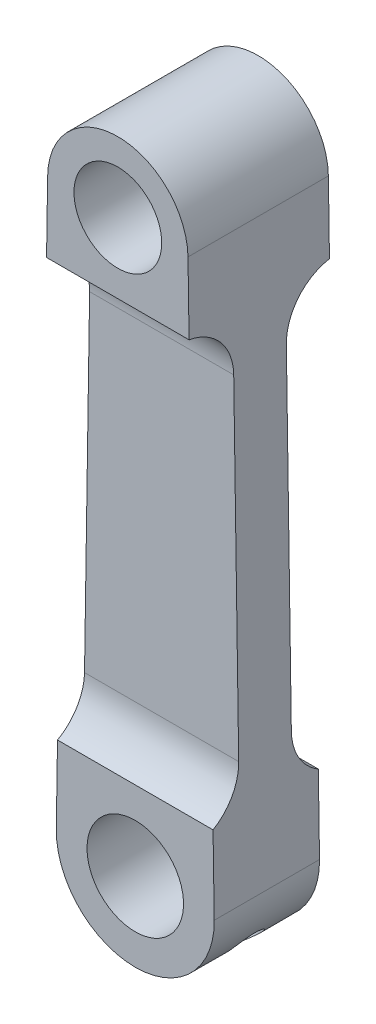
ISO-10303-21;
HEADER;
FILE_DESCRIPTION(('STEP AP214'),'2;1');
FILE_NAME('part.step','',(''),(''),'','','');
FILE_SCHEMA(('AUTOMOTIVE_DESIGN { 1 0 10303 214 1 1 1 1 }'));
ENDSEC;
DATA;
#1=APPLICATION_CONTEXT('core data for automotive mechanical design processes');
#2=APPLICATION_PROTOCOL_DEFINITION('international standard','automotive_design',2000,#1);
#3=PRODUCT_CONTEXT('',#1,'mechanical');
#4=PRODUCT('Part','Part','',(#3));
#5=PRODUCT_RELATED_PRODUCT_CATEGORY('part','',(#4));
#6=PRODUCT_DEFINITION_FORMATION('','',#4);
#7=PRODUCT_DEFINITION_CONTEXT('part definition',#1,'design');
#8=PRODUCT_DEFINITION('design','',#6,#7);
#9=PRODUCT_DEFINITION_SHAPE('','',#8);
#10=(LENGTH_UNIT() NAMED_UNIT(*) SI_UNIT(.MILLI.,.METRE.));
#11=(NAMED_UNIT(*) PLANE_ANGLE_UNIT() SI_UNIT($,.RADIAN.));
#12=(NAMED_UNIT(*) SI_UNIT($,.STERADIAN.) SOLID_ANGLE_UNIT());
#13=UNCERTAINTY_MEASURE_WITH_UNIT(LENGTH_MEASURE(1.E-05),#10,'distance_accuracy_value','');
#14=(GEOMETRIC_REPRESENTATION_CONTEXT(3) GLOBAL_UNCERTAINTY_ASSIGNED_CONTEXT((#13)) GLOBAL_UNIT_ASSIGNED_CONTEXT((#10,
#11,#12)) REPRESENTATION_CONTEXT('',''));
#15=CARTESIAN_POINT('',(0.,0.,0.));
#16=DIRECTION('',(0.,0.,1.));
#17=DIRECTION('',(1.,0.,0.));
#18=AXIS2_PLACEMENT_3D('',#15,#16,#17);
#19=CARTESIAN_POINT('',(0.,81.4999973502,26.5685520698));
#20=DIRECTION('',(0.,0.,-1.));
#21=DIRECTION('',(0.,1.,0.));
#22=AXIS2_PLACEMENT_3D('',#19,#20,#21);
#23=CYLINDRICAL_SURFACE('',#22,2.5000000038);
#24=CARTESIAN_POINT('',(0.,81.4999973502,26.5685520698));
#25=DIRECTION('',(0.,0.,-1.));
#26=DIRECTION('',(0.,1.,0.));
#27=AXIS2_PLACEMENT_3D('',#24,#25,#26);
#28=CIRCLE('',#27,2.5000000038);
#29=CARTESIAN_POINT('',(0.,83.999997354,26.5685520698));
#30=VERTEX_POINT('',#29);
#31=EDGE_CURVE('E214',#30,#30,#28,.T.);
#32=ORIENTED_EDGE('',*,*,#31,.F.);
#33=EDGE_LOOP('',(#32));
#34=FACE_BOUND('',#33,.T.);
#35=CARTESIAN_POINT('',(0.,81.4999973502,18.5685520678));
#36=DIRECTION('',(0.,0.,-1.));
#37=DIRECTION('',(0.,1.,0.));
#38=AXIS2_PLACEMENT_3D('',#35,#36,#37);
#39=CIRCLE('',#38,2.5000000038);
#40=CARTESIAN_POINT('',(0.,83.999997354,18.5685520678));
#41=VERTEX_POINT('',#40);
#42=EDGE_CURVE('E236',#41,#41,#39,.T.);
#43=ORIENTED_EDGE('',*,*,#42,.T.);
#44=EDGE_LOOP('',(#43));
#45=FACE_BOUND('',#44,.T.);
#46=ADVANCED_FACE('F16',(#34,#45),#23,.F.);
#47=CARTESIAN_POINT('',(4.493508412,48.5673633426,18.5685520678));
#48=DIRECTION('',(0.999887941750433,0.0149701016056297,0.));
#49=DIRECTION('',(-0.0149701016056297,0.999887941750433,0.));
#50=AXIS2_PLACEMENT_3D('',#47,#48,#49);
#51=PLANE('',#50);
#52=DIRECTION('',(-0.0149701016056297,0.999887941750433,0.));
#53=VECTOR('',#52,1.);
#54=CARTESIAN_POINT('',(4.493508412,48.5673633426,18.5685520678));
#55=LINE('',#54,#53);
#56=CARTESIAN_POINT('',(4.06034643128432,77.4992605836624,18.5685520701346));
#57=VERTEX_POINT('',#56);
#58=CARTESIAN_POINT('',(3.99955176753491,81.5598777570202,18.5685520678));
#59=VERTEX_POINT('',#58);
#60=EDGE_CURVE('E257',#57,#59,#55,.T.);
#61=ORIENTED_EDGE('',*,*,#60,.T.);
#62=DIRECTION('',(0.,0.,-1.));
#63=VECTOR('',#62,1.);
#64=CARTESIAN_POINT('',(3.99955176798995,81.5598777574168,22.5685520688));
#65=LINE('',#64,#63);
#66=CARTESIAN_POINT('',(3.99955177192008,81.5598777582927,26.5685520698));
#67=VERTEX_POINT('',#66);
#68=EDGE_CURVE('E212',#59,#67,#65,.F.);
#69=ORIENTED_EDGE('',*,*,#68,.T.);
#70=DIRECTION('',(-0.0149701022089109,0.999887941741401,0.));
#71=VECTOR('',#70,1.);
#72=CARTESIAN_POINT('',(4.06034644230824,77.4992605993605,26.5685520698));
#73=LINE('',#72,#71);
#74=CARTESIAN_POINT('',(4.06034643664644,77.4992606015195,26.5685520682785));
#75=VERTEX_POINT('',#74);
#76=EDGE_CURVE('E243',#75,#67,#73,.T.);
#77=ORIENTED_EDGE('',*,*,#76,.F.);
#78=CARTESIAN_POINT('',(4.10463367244879,74.5412126304615,27.0685520604));
#79=DIRECTION('',(0.999887941750433,0.0149701016056297,0.));
#80=DIRECTION('',(0.0149701016056297,-0.999887941750433,0.));
#81=AXIS2_PLACEMENT_3D('',#78,#79,#80);
#82=ELLIPSE('',#81,3.00034440865254,2.99999999674174);
#83=CARTESIAN_POINT('',(4.10463368120887,74.5412126267578,24.0685520633135));
#84=VERTEX_POINT('',#83);
#85=EDGE_CURVE('E244',#84,#75,#82,.T.);
#86=ORIENTED_EDGE('',*,*,#85,.F.);
#87=DIRECTION('',(-0.0149701007964448,0.999887941762548,0.));
#88=VECTOR('',#87,1.);
#89=CARTESIAN_POINT('',(4.38825809881793,55.5972769573051,24.068552066));
#90=LINE('',#89,#88);
#91=CARTESIAN_POINT('',(4.38825809785737,55.5972769521677,24.0685520686545));
#92=VERTEX_POINT('',#91);
#93=EDGE_CURVE('E89',#92,#84,#90,.T.);
#94=ORIENTED_EDGE('',*,*,#93,.F.);
#95=CARTESIAN_POINT('',(4.38825809689681,55.5972769470302,27.0685520604));
#96=DIRECTION('',(0.999887941750433,0.0149701016056297,0.));
#97=DIRECTION('',(-0.0149701016056297,0.999887941750433,0.));
#98=AXIS2_PLACEMENT_3D('',#95,#96,#97);
#99=ELLIPSE('',#98,3.00034440100083,2.99999998909091);
#100=CARTESIAN_POINT('',(4.42715602844908,52.9991936466253,25.5685520649593));
#101=VERTEX_POINT('',#100);
#102=EDGE_CURVE('E20',#101,#92,#99,.T.);
#103=ORIENTED_EDGE('',*,*,#102,.F.);
#104=DIRECTION('',(-0.0149701012397635,0.99988794175591,0.));
#105=VECTOR('',#104,1.);
#106=CARTESIAN_POINT('',(4.49350841370545,48.5673633516394,25.5685520632));
#107=LINE('',#106,#105);
#108=CARTESIAN_POINT('',(4.49350841489874,48.567363351097,25.5685520632));
#109=VERTEX_POINT('',#108);
#110=EDGE_CURVE('E87',#109,#101,#107,.T.);
#111=ORIENTED_EDGE('',*,*,#110,.F.);
#112=DIRECTION('',(0.,0.,1.));
#113=VECTOR('',#112,1.);
#114=CARTESIAN_POINT('',(4.49350841606476,48.5673633523763,22.5685520688));
#115=LINE('',#114,#113);
#116=CARTESIAN_POINT('',(4.49350841396623,48.5673633519064,19.5685520744));
#117=VERTEX_POINT('',#116);
#118=EDGE_CURVE('E203',#109,#117,#115,.F.);
#119=ORIENTED_EDGE('',*,*,#118,.T.);
#120=DIRECTION('',(-0.0149701016056297,0.999887941750433,0.));
#121=VECTOR('',#120,1.);
#122=CARTESIAN_POINT('',(4.493508412,48.5673633426,19.5685520744));
#123=LINE('',#122,#121);
#124=CARTESIAN_POINT('',(4.42715602675402,52.9991936441981,19.5685520744));
#125=VERTEX_POINT('',#124);
#126=EDGE_CURVE('E202',#117,#125,#123,.T.);
#127=ORIENTED_EDGE('',*,*,#126,.T.);
#128=CARTESIAN_POINT('',(4.38825809678039,55.5972769548059,18.0685520772));
#129=DIRECTION('',(0.999887941750433,0.0149701016056297,0.));
#130=DIRECTION('',(0.0149701016056297,-0.999887941750433,0.));
#131=AXIS2_PLACEMENT_3D('',#128,#129,#130);
#132=ELLIPSE('',#131,3.0003444137,3.00000000178862);
#133=CARTESIAN_POINT('',(4.38825809681372,55.5972769525799,21.0685520789886));
#134=VERTEX_POINT('',#133);
#135=EDGE_CURVE('E109',#134,#125,#132,.T.);
#136=ORIENTED_EDGE('',*,*,#135,.F.);
#137=DIRECTION('',(-0.0149701016056297,0.999887941750433,0.));
#138=VECTOR('',#137,1.);
#139=CARTESIAN_POINT('',(4.493508412,48.5673633426,21.0685520716));
#140=LINE('',#139,#138);
#141=CARTESIAN_POINT('',(4.10463367269257,74.5412126141785,21.0685520727697));
#142=VERTEX_POINT('',#141);
#143=EDGE_CURVE('E231',#134,#142,#140,.T.);
#144=ORIENTED_EDGE('',*,*,#143,.T.);
#145=CARTESIAN_POINT('',(4.10463367271639,74.5412126125874,18.0685520772));
#146=DIRECTION('',(0.999887941750433,0.0149701016056297,0.));
#147=DIRECTION('',(-0.0149701016056297,0.999887941750433,0.));
#148=AXIS2_PLACEMENT_3D('',#145,#146,#147);
#149=ELLIPSE('',#148,3.00034440865026,2.99999999673946);
#150=EDGE_CURVE('E235',#57,#142,#149,.T.);
#151=ORIENTED_EDGE('',*,*,#150,.F.);
#152=EDGE_LOOP('',(#61,#69,#77,#86,#94,#103,#111,#119,#127,#136,#144,#151));
#153=FACE_BOUND('',#152,.T.);
#154=ADVANCED_FACE('F84',(#153),#51,.T.);
#155=CARTESIAN_POINT('',(-0.00598731340000001,48.4999978944,25.5685520632));
#156=DIRECTION('',(0.,0.,-1.));
#157=DIRECTION('',(-1.,0.,0.));
#158=AXIS2_PLACEMENT_3D('',#155,#156,#157);
#159=CYLINDRICAL_SURFACE('',#158,2.7500000118);
#160=CARTESIAN_POINT('',(-0.00598731340000001,48.4999978944,25.5685520632));
#161=DIRECTION('',(0.,0.,-1.));
#162=DIRECTION('',(-1.,0.,0.));
#163=AXIS2_PLACEMENT_3D('',#160,#161,#162);
#164=CIRCLE('',#163,2.7500000118);
#165=CARTESIAN_POINT('',(-2.7559873252,48.4999978944,25.5685520632));
#166=VERTEX_POINT('',#165);
#167=EDGE_CURVE('E103',#166,#166,#164,.T.);
#168=ORIENTED_EDGE('',*,*,#167,.F.);
#169=EDGE_LOOP('',(#168));
#170=FACE_BOUND('',#169,.T.);
#171=CARTESIAN_POINT('',(-0.00598731340000001,48.4999978944,19.5685520744));
#172=DIRECTION('',(0.,0.,-1.));
#173=DIRECTION('',(-1.,0.,0.));
#174=AXIS2_PLACEMENT_3D('',#171,#172,#173);
#175=CIRCLE('',#174,2.7500000118);
#176=CARTESIAN_POINT('',(-2.7559873252,48.4999978944,19.5685520744));
#177=VERTEX_POINT('',#176);
#178=EDGE_CURVE('E198',#177,#177,#175,.T.);
#179=ORIENTED_EDGE('',*,*,#178,.T.);
#180=EDGE_LOOP('',(#179));
#181=FACE_BOUND('',#180,.T.);
#182=CARTESIAN_POINT('',(2.51234114031025,47.395225598184,22.5685520683898));
#183=CARTESIAN_POINT('',(2.51234096619776,47.3952211985976,22.514494560565));
#184=CARTESIAN_POINT('',(2.510450991853,47.3908855763633,22.4603841918302));
#185=CARTESIAN_POINT('',(2.50285492022981,47.3738125252695,22.3537315913413));
#186=CARTESIAN_POINT('',(2.49714264181015,47.361061488095,22.3011920437987));
#187=CARTESIAN_POINT('',(2.48182965598258,47.3279931344561,22.199332972728));
#188=CARTESIAN_POINT('',(2.4722402904659,47.3076979013512,22.1500045400487));
#189=CARTESIAN_POINT('',(2.44903662345772,47.2606257268212,22.0555919818943));
#190=CARTESIAN_POINT('',(2.43542243684333,47.2338489703969,22.0105077353293));
#191=CARTESIAN_POINT('',(2.40333199922162,47.1737676763861,21.9237323257375));
#192=CARTESIAN_POINT('',(2.38467344928783,47.1402337846818,21.8822672936029));
#193=CARTESIAN_POINT('',(2.34263627089483,47.0688510171367,21.8059553745119));
#194=CARTESIAN_POINT('',(2.31925649903329,47.0310010969932,21.7711100947258));
#195=CARTESIAN_POINT('',(2.26691075360155,46.9511985588941,21.7079615509369));
#196=CARTESIAN_POINT('',(2.2377911780357,46.9091539148221,21.679900713297));
#197=CARTESIAN_POINT('',(2.17469204272838,46.8237065815634,21.6327347395387));
#198=CARTESIAN_POINT('',(2.14071407453093,46.7803043407306,21.6136266793436));
#199=CARTESIAN_POINT('',(2.0699735402066,46.6956129635321,21.5856919015266));
#200=CARTESIAN_POINT('',(2.03338112504607,46.654309856029,21.576477547251));
#201=CARTESIAN_POINT('',(1.95720353933929,46.5734824146185,21.5673524049975));
#202=CARTESIAN_POINT('',(1.91761928908483,46.5339575396443,21.5674387676538));
#203=CARTESIAN_POINT('',(1.83860131895394,46.4597043609429,21.5766811079299));
#204=CARTESIAN_POINT('',(1.79924642152885,46.4248384061898,21.5854145680766));
#205=CARTESIAN_POINT('',(1.7202096446299,46.3586425277945,21.6109959360563));
#206=CARTESIAN_POINT('',(1.6805277413476,46.3273128641051,21.6278444399474));
#207=CARTESIAN_POINT('',(1.60158786384854,46.2682567014926,21.6693881242126));
#208=CARTESIAN_POINT('',(1.5623439901196,46.2405879141512,21.6941917059703));
#209=CARTESIAN_POINT('',(1.4861957703355,46.1895881903245,21.7508464629601));
#210=CARTESIAN_POINT('',(1.449292048903,46.1662584088016,21.7826995097011));
#211=CARTESIAN_POINT('',(1.37717685451721,46.1227667978942,21.854606762493));
#212=CARTESIAN_POINT('',(1.34217115125981,46.1028508370614,21.8950165422776));
#213=CARTESIAN_POINT('',(1.27766433510844,46.0676961430175,21.9818629296322));
#214=CARTESIAN_POINT('',(1.24816616441278,46.0524599069912,22.0283027361934));
#215=CARTESIAN_POINT('',(1.1955930910079,46.0262177837185,22.127094820053));
#216=CARTESIAN_POINT('',(1.1726618772368,46.0153047769641,22.1795485845037));
#217=CARTESIAN_POINT('',(1.13547161949544,45.9979988694358,22.2880787337553));
#218=CARTESIAN_POINT('',(1.12119405585221,45.9915963110494,22.3441470962036));
#219=CARTESIAN_POINT('',(1.10712747855165,45.9853415494268,22.4287268308869));
#220=CARTESIAN_POINT('',(1.10366368246204,45.9838140430455,22.4565519360204));
#221=CARTESIAN_POINT('',(1.09903431999063,45.9817775693018,22.5124306329612));
#222=CARTESIAN_POINT('',(1.09786875826505,45.9812686040031,22.5404842252312));
#223=CARTESIAN_POINT('',(1.09787544133482,45.9812688612635,22.6226095757722));
#224=CARTESIAN_POINT('',(1.10221175059898,45.9831572703819,22.6767199441095));
#225=CARTESIAN_POINT('',(1.11928755809903,45.990747151945,22.7833725443552));
#226=CARTESIAN_POINT('',(1.13204066693938,45.9964548005979,22.8359120920426));
#227=CARTESIAN_POINT('',(1.16511457499445,46.0117557837621,22.9377711631413));
#228=CARTESIAN_POINT('',(1.18541328670774,46.0213377843751,22.9870995957146));
#229=CARTESIAN_POINT('',(1.23249387835758,46.0445243683765,23.0815121534752));
#230=CARTESIAN_POINT('',(1.25927557322367,46.0581288369375,23.1265963997708));
#231=CARTESIAN_POINT('',(1.31936850814086,46.0901974694866,23.2133718090702));
#232=CARTESIAN_POINT('',(1.35290916847,46.108843849184,23.2548368411625));
#233=CARTESIAN_POINT('',(1.42430718586535,46.1508551208964,23.3311487603255));
#234=CARTESIAN_POINT('',(1.46216558765836,46.1742211559449,23.3659940402116));
#235=CARTESIAN_POINT('',(1.54198711615095,46.2265379387081,23.4291425844375));
#236=CARTESIAN_POINT('',(1.58404232471681,46.25564225504,23.4572034223744));
#237=CARTESIAN_POINT('',(1.66951255048077,46.3187103787603,23.5043693966838));
#238=CARTESIAN_POINT('',(1.71292711874652,46.3526725947636,23.5234774571401));
#239=CARTESIAN_POINT('',(1.7976441615131,46.4233823914277,23.5514122354536));
#240=CARTESIAN_POINT('',(1.83896054540377,46.4599598160671,23.5606265899529));
#241=CARTESIAN_POINT('',(1.91981562573732,46.5361080660838,23.5697517325572));
#242=CARTESIAN_POINT('',(1.95935486291266,46.5756779709734,23.569665370027));
#243=CARTESIAN_POINT('',(2.03363671149544,46.6546689908288,23.5604230298887));
#244=CARTESIAN_POINT('',(2.0685169453304,46.6940112333881,23.5516895697995));
#245=CARTESIAN_POINT('',(2.1347415007758,46.77302398372,23.526108201869));
#246=CARTESIAN_POINT('',(2.16608556244105,46.8126945153955,23.5092596979673));
#247=CARTESIAN_POINT('',(2.22517036723468,46.8916129570307,23.467716013709));
#248=CARTESIAN_POINT('',(2.25285339368822,46.9308467874507,23.4429124320057));
#249=CARTESIAN_POINT('',(2.30388074702044,47.0069764948561,23.3862576751533));
#250=CARTESIAN_POINT('',(2.32722391871494,47.0438717476405,23.3544046285029));
#251=CARTESIAN_POINT('',(2.37074169604298,47.1159711543143,23.2824973760378));
#252=CARTESIAN_POINT('',(2.39067035848792,47.1509696277564,23.2420875965131));
#253=CARTESIAN_POINT('',(2.42584845854555,47.2154636820639,23.1552412096333));
#254=CARTESIAN_POINT('',(2.44109539789332,47.2449563216227,23.1088014032709));
#255=CARTESIAN_POINT('',(2.46735659757443,47.2975198685225,23.0100093196964));
#256=CARTESIAN_POINT('',(2.47827792527046,47.3204471206176,22.9575555553155));
#257=CARTESIAN_POINT('',(2.49559732675055,47.3576310956096,22.8490254064476));
#258=CARTESIAN_POINT('',(2.50200506488944,47.3719063347123,22.7929570443298));
#259=CARTESIAN_POINT('',(2.50826493269155,47.3859706419075,22.7083773094388));
#260=CARTESIAN_POINT('',(2.50979369714299,47.3894338837929,22.6805522037219));
#261=CARTESIAN_POINT('',(2.51183184718833,47.3940625064439,22.6246735053916));
#262=CARTESIAN_POINT('',(2.51234123071328,47.3952278825458,22.5966199123146));
#263=CARTESIAN_POINT('',(2.51234114031025,47.395225598184,22.5685520683898));
#264=B_SPLINE_CURVE_WITH_KNOTS('',3,(#182,#183,#184,#185,#186,#187,#188,#189,#190,#191,#192,
#193,#194,#195,#196,#197,#198,#199,#200,#201,#202,#203,#204,#205,#206,#207,#208,#209,#210,#211,
#212,#213,#214,#215,#216,#217,#218,#219,#220,#221,#222,#223,#224,#225,#226,#227,#228,#229,#230,
#231,#232,#233,#234,#235,#236,#237,#238,#239,#240,#241,#242,#243,#244,#245,#246,#247,#248,#249,
#250,#251,#252,#253,#254,#255,#256,#257,#258,#259,#260,#261,#262,#263),.UNSPECIFIED.,.T.,.F.,(4,
2,2,2,2,2,2,2,2,2,2,2,2,2,2,2,2,2,2,2,2,2,2,2,2,2,2,2,2,2,2,2,2,2,2,2,2,2,2,2,4),(0.,
0.162062858142711,0.324388427499844,0.4862425321847,0.648092017649166,0.816831109690325,
0.985611116681562,1.15974200512968,1.33381598077638,1.500788418408,1.66770970254039,
1.82685823102374,1.98601845091202,2.14744686690715,2.30891819082416,2.47930022439786,
2.64977301954262,2.82373191406314,2.99731719246503,3.08146361096277,3.16561019994133,
3.32767305739332,3.48999862703251,3.65185273144392,3.8137022159325,3.98244130763824,
4.1512213146589,4.32535220405047,4.49942618050444,4.66639861915663,4.83331990432889,
4.99246843305231,5.15162865322387,5.31305706872001,5.47452839196484,5.64491042428042,
5.81538321862294,5.98934211292271,6.16292739033139,6.24707381067454,6.33122040180292),.UNSPECIFIED.);
#265=CARTESIAN_POINT('',(2.51234114031025,47.395225598184,22.5685520683898));
#266=VERTEX_POINT('',#265);
#267=EDGE_CURVE('E106',#266,#266,#264,.T.);
#268=ORIENTED_EDGE('',*,*,#267,.F.);
#269=EDGE_LOOP('',(#268));
#270=FACE_BOUND('',#269,.T.);
#271=ADVANCED_FACE('F124',(#170,#181,#270),#159,.F.);
#272=CARTESIAN_POINT('',(4.48081532613272,55.5972601540036,27.0685520604));
#273=DIRECTION('',(-0.999999983540856,0.000181433977996246,0.));
#274=DIRECTION('',(-0.000181433977996246,-0.999999983540856,0.));
#275=AXIS2_PLACEMENT_3D('',#272,#273,#274);
#276=CYLINDRICAL_SURFACE('',#275,2.99999998909091);
#277=DIRECTION('',(0.99999998354112,-0.000181432523983697,0.));
#278=VECTOR('',#277,1.);
#279=CARTESIAN_POINT('',(-0.0046994825999994,55.5980739827,24.068552066));
#280=LINE('',#279,#278);
#281=CARTESIAN_POINT('',(-4.39765708304414,55.5988710093481,24.0685520686545));
#282=VERTEX_POINT('',#281);
#283=EDGE_CURVE('E93',#282,#92,#280,.T.);
#284=ORIENTED_EDGE('',*,*,#283,.F.);
#285=CARTESIAN_POINT('',(-4.39765708302498,55.5988710105979,27.0685520604));
#286=DIRECTION('',(-0.999882443743837,0.0153329283847569,0.));
#287=DIRECTION('',(-0.0153329283847569,-0.999882443743837,0.));
#288=AXIS2_PLACEMENT_3D('',#285,#286,#287);
#289=ELLIPSE('',#288,3.00034440102252,2.99999998909091);
#290=CARTESIAN_POINT('',(-4.43749777271393,53.0008019942295,25.568552066375));
#291=VERTEX_POINT('',#290);
#292=EDGE_CURVE('E100',#291,#282,#289,.F.);
#293=ORIENTED_EDGE('',*,*,#292,.F.);
#294=DIRECTION('',(-0.999999983540897,0.000181433750679129,0.));
#295=VECTOR('',#294,1.);
#296=CARTESIAN_POINT('',(-0.0051708685000003,52.9999978225,25.5685520632));
#297=LINE('',#296,#295);
#298=EDGE_CURVE('E96',#101,#291,#297,.T.);
#299=ORIENTED_EDGE('',*,*,#298,.F.);
#300=ORIENTED_EDGE('',*,*,#102,.T.);
#301=EDGE_LOOP('',(#284,#293,#299,#300));
#302=FACE_BOUND('',#301,.T.);
#303=ADVANCED_FACE('F97',(#302),#276,.F.);
#304=CARTESIAN_POINT('',(-4.4469355054,74.542764173,24.068552066));
#305=DIRECTION('',(0.,0.,1.));
#306=DIRECTION('',(-0.000181433322537988,-0.999999983540975,0.));
#307=AXIS2_PLACEMENT_3D('',#304,#305,#306);
#308=PLANE('',#307);
#309=DIRECTION('',(-0.999999983540856,0.000181433978000328,9.06166437992229E-10));
#310=VECTOR('',#309,1.);
#311=CARTESIAN_POINT('',(-0.00126242343362034,74.5419575783816,24.0685520636583));
#312=LINE('',#311,#310);
#313=CARTESIAN_POINT('',(-4.10715852111188,74.5427025280332,24.0685520659676));
#314=VERTEX_POINT('',#313);
#315=EDGE_CURVE('E245',#314,#84,#312,.F.);
#316=ORIENTED_EDGE('',*,*,#315,.F.);
#317=DIRECTION('',(0.0153329283847569,0.999882443743837,0.));
#318=VECTOR('',#317,1.);
#319=CARTESIAN_POINT('',(-4.2524940477,65.0651625669,24.068552069175));
#320=LINE('',#319,#318);
#321=EDGE_CURVE('E195',#282,#314,#320,.T.);
#322=ORIENTED_EDGE('',*,*,#321,.F.);
#323=ORIENTED_EDGE('',*,*,#283,.T.);
#324=ORIENTED_EDGE('',*,*,#93,.T.);
#325=EDGE_LOOP('',(#316,#322,#323,#324));
#326=FACE_BOUND('',#325,.T.);
#327=ADVANCED_FACE('F136',(#326),#308,.T.);
#328=CARTESIAN_POINT('',(-4.15642928453273,74.542711468001,27.0685520604));
#329=DIRECTION('',(0.999999983540856,-0.000181433978000861,0.));
#330=DIRECTION('',(0.000181433978000861,0.999999983540856,0.));
#331=AXIS2_PLACEMENT_3D('',#328,#329,#330);
#332=CYLINDRICAL_SURFACE('',#331,2.99999999674174);
#333=ORIENTED_EDGE('',*,*,#315,.T.);
#334=ORIENTED_EDGE('',*,*,#85,.T.);
#335=DIRECTION('',(0.999999983540997,-0.000181433201969554,0.));
#336=VECTOR('',#335,1.);
#337=CARTESIAN_POINT('',(-0.000725728799999981,77.4999974127,26.5685520698));
#338=LINE('',#337,#336);
#339=CARTESIAN_POINT('',(-4.0617979004164,77.5007342316064,26.5685520698));
#340=VERTEX_POINT('',#339);
#341=EDGE_CURVE('E240',#340,#75,#338,.T.);
#342=ORIENTED_EDGE('',*,*,#341,.F.);
#343=CARTESIAN_POINT('',(-4.10715852110303,74.5427025286102,27.0685520604));
#344=DIRECTION('',(-0.999882443743837,0.0153329283847569,0.));
#345=DIRECTION('',(0.0153329283847569,0.999882443743837,0.));
#346=AXIS2_PLACEMENT_3D('',#343,#344,#345);
#347=ELLIPSE('',#346,3.00034440867423,2.99999999674174);
#348=EDGE_CURVE('E191',#314,#340,#347,.F.);
#349=ORIENTED_EDGE('',*,*,#348,.F.);
#350=EDGE_LOOP('',(#333,#334,#342,#349));
#351=FACE_BOUND('',#350,.T.);
#352=ADVANCED_FACE('F139',(#351),#332,.F.);
#353=CARTESIAN_POINT('',(-4.1090705982,85.5487429484,26.5685520698));
#354=DIRECTION('',(0.,0.,1.));
#355=DIRECTION('',(-0.000181432628930043,-0.9999999835411,0.));
#356=AXIS2_PLACEMENT_3D('',#353,#354,#355);
#357=PLANE('',#356);
#358=ORIENTED_EDGE('',*,*,#31,.T.);
#359=EDGE_LOOP('',(#358));
#360=FACE_BOUND('',#359,.T.);
#361=ORIENTED_EDGE('',*,*,#341,.T.);
#362=ORIENTED_EDGE('',*,*,#76,.T.);
#363=CARTESIAN_POINT('',(0.,81.4999973502,26.5685520698));
#364=DIRECTION('',(0.,0.,1.));
#365=DIRECTION('',(0.,-1.,0.));
#366=AXIS2_PLACEMENT_3D('',#363,#364,#365);
#367=CIRCLE('',#366,4.000000001);
#368=CARTESIAN_POINT('',(-3.9995297707243,81.5613290587363,26.5685520698));
#369=VERTEX_POINT('',#368);
#370=EDGE_CURVE('E213',#67,#369,#367,.T.);
#371=ORIENTED_EDGE('',*,*,#370,.T.);
#372=DIRECTION('',(0.0153329283847569,0.999882443743837,0.));
#373=VECTOR('',#372,1.);
#374=CARTESIAN_POINT('',(-4.2524940477,65.0651625669,26.5685520698));
#375=LINE('',#374,#373);
#376=EDGE_CURVE('E194',#340,#369,#375,.T.);
#377=ORIENTED_EDGE('',*,*,#376,.F.);
#378=EDGE_LOOP('',(#361,#362,#371,#377));
#379=FACE_BOUND('',#378,.T.);
#380=ADVANCED_FACE('F141',(#360,#379),#357,.T.);
#381=CARTESIAN_POINT('',(0.,81.4999973502,18.5685520678));
#382=DIRECTION('',(0.,0.,1.));
#383=DIRECTION('',(0.,-1.,0.));
#384=AXIS2_PLACEMENT_3D('',#381,#382,#383);
#385=CYLINDRICAL_SURFACE('',#384,4.000000001);
#386=ORIENTED_EDGE('',*,*,#370,.F.);
#387=ORIENTED_EDGE('',*,*,#68,.F.);
#388=CARTESIAN_POINT('',(0.,81.4999973502,18.5685520678));
#389=DIRECTION('',(0.,0.,1.));
#390=DIRECTION('',(0.,-1.,0.));
#391=AXIS2_PLACEMENT_3D('',#388,#389,#390);
#392=CIRCLE('',#391,4.000000001);
#393=CARTESIAN_POINT('',(-3.9995297707243,81.5613290587363,18.5685520678));
#394=VERTEX_POINT('',#393);
#395=EDGE_CURVE('E259',#59,#394,#392,.T.);
#396=ORIENTED_EDGE('',*,*,#395,.T.);
#397=DIRECTION('',(0.,0.,-1.));
#398=VECTOR('',#397,1.);
#399=CARTESIAN_POINT('',(-3.9995297708,81.5613290538,22.5685520688));
#400=LINE('',#399,#398);
#401=EDGE_CURVE('E237',#369,#394,#400,.T.);
#402=ORIENTED_EDGE('',*,*,#401,.F.);
#403=EDGE_LOOP('',(#386,#387,#396,#402));
#404=FACE_BOUND('',#403,.T.);
#405=ADVANCED_FACE('F144',(#404),#385,.T.);
#406=CARTESIAN_POINT('',(-4.1090705982,85.5487429484,18.5685520678));
#407=DIRECTION('',(0.,0.,1.));
#408=DIRECTION('',(-0.000181432628930043,-0.9999999835411,0.));
#409=AXIS2_PLACEMENT_3D('',#406,#407,#408);
#410=PLANE('',#409);
#411=ORIENTED_EDGE('',*,*,#42,.F.);
#412=EDGE_LOOP('',(#411));
#413=FACE_BOUND('',#412,.T.);
#414=ORIENTED_EDGE('',*,*,#60,.F.);
#415=DIRECTION('',(-0.999999983540694,0.000181434870947616,1.50935336587713E-10));
#416=VECTOR('',#415,1.);
#417=CARTESIAN_POINT('',(-0.00072573652259815,77.499997401125,18.5685520777514));
#418=LINE('',#417,#416);
#419=CARTESIAN_POINT('',(-4.06179790059026,77.500734220269,18.5685520730822));
#420=VERTEX_POINT('',#419);
#421=EDGE_CURVE('E232',#420,#57,#418,.F.);
#422=ORIENTED_EDGE('',*,*,#421,.F.);
#423=DIRECTION('',(-0.0153329283847569,-0.999882443743837,0.));
#424=VECTOR('',#423,1.);
#425=CARTESIAN_POINT('',(-4.2524940477,65.0651625669,18.5685520678));
#426=LINE('',#425,#424);
#427=EDGE_CURVE('E190',#394,#420,#426,.T.);
#428=ORIENTED_EDGE('',*,*,#427,.F.);
#429=ORIENTED_EDGE('',*,*,#395,.F.);
#430=EDGE_LOOP('',(#414,#422,#428,#429));
#431=FACE_BOUND('',#430,.T.);
#432=ADVANCED_FACE('F146',(#413,#431),#410,.F.);
#433=CARTESIAN_POINT('',(4.15390442293273,74.541203673199,18.0685520772));
#434=DIRECTION('',(-0.999999983540856,0.000181433978000427,0.));
#435=DIRECTION('',(-0.000181433978000427,-0.999999983540856,0.));
#436=AXIS2_PLACEMENT_3D('',#433,#434,#435);
#437=CYLINDRICAL_SURFACE('',#436,2.99999999673946);
#438=DIRECTION('',(-0.999999983540601,0.000181435380174927,0.));
#439=VECTOR('',#438,1.);
#440=CARTESIAN_POINT('',(-0.00126241809999964,74.5419575706,21.0685520716));
#441=LINE('',#440,#439);
#442=CARTESIAN_POINT('',(-4.10715852126444,74.5427025180845,21.068552071976));
#443=VERTEX_POINT('',#442);
#444=EDGE_CURVE('E228',#142,#443,#441,.T.);
#445=ORIENTED_EDGE('',*,*,#444,.T.);
#446=CARTESIAN_POINT('',(-4.10715852137713,74.5427025107362,18.0685520772));
#447=DIRECTION('',(-0.999882443743837,0.0153329283847569,0.));
#448=DIRECTION('',(-0.0153329283847569,-0.999882443743837,0.));
#449=AXIS2_PLACEMENT_3D('',#446,#447,#448);
#450=ELLIPSE('',#449,3.00034440867195,2.99999999673946);
#451=EDGE_CURVE('E187',#420,#443,#450,.F.);
#452=ORIENTED_EDGE('',*,*,#451,.F.);
#453=ORIENTED_EDGE('',*,*,#421,.T.);
#454=ORIENTED_EDGE('',*,*,#150,.T.);
#455=EDGE_LOOP('',(#445,#452,#453,#454));
#456=FACE_BOUND('',#455,.T.);
#457=ADVANCED_FACE('F149',(#456),#437,.F.);
#458=CARTESIAN_POINT('',(-4.4469355054,74.542764173,21.0685520716));
#459=DIRECTION('',(0.,0.,1.));
#460=DIRECTION('',(-0.000181433322537988,-0.999999983540975,0.));
#461=AXIS2_PLACEMENT_3D('',#458,#459,#460);
#462=PLANE('',#461);
#463=DIRECTION('',(-0.0153329283847569,-0.999882443743837,0.));
#464=VECTOR('',#463,1.);
#465=CARTESIAN_POINT('',(-4.2524940477,65.0651625669,21.068552068425));
#466=LINE('',#465,#464);
#467=CARTESIAN_POINT('',(-4.39765708291046,55.5988710180659,21.0685520741901));
#468=VERTEX_POINT('',#467);
#469=EDGE_CURVE('E186',#443,#468,#466,.T.);
#470=ORIENTED_EDGE('',*,*,#469,.F.);
#471=ORIENTED_EDGE('',*,*,#444,.F.);
#472=ORIENTED_EDGE('',*,*,#143,.F.);
#473=DIRECTION('',(-0.999999983540856,0.000181433978000792,-1.96458298896835E-09));
#474=VECTOR('',#473,1.);
#475=CARTESIAN_POINT('',(-0.00469948793443845,55.5980739859735,21.0685520789886));
#476=LINE('',#475,#474);
#477=EDGE_CURVE('E225',#468,#134,#476,.F.);
#478=ORIENTED_EDGE('',*,*,#477,.F.);
#479=EDGE_LOOP('',(#470,#471,#472,#478));
#480=FACE_BOUND('',#479,.T.);
#481=ADVANCED_FACE('F151',(#480),#462,.F.);
#482=CARTESIAN_POINT('',(-4.49021431673273,55.598887811401,18.0685520772));
#483=DIRECTION('',(0.999999983540856,-0.000181433978000718,0.));
#484=DIRECTION('',(0.000181433978000718,0.999999983540856,0.));
#485=AXIS2_PLACEMENT_3D('',#482,#483,#484);
#486=CYLINDRICAL_SURFACE('',#485,3.00000000178862);
#487=ORIENTED_EDGE('',*,*,#477,.T.);
#488=ORIENTED_EDGE('',*,*,#135,.T.);
#489=DIRECTION('',(-0.999999983540897,0.000181433750679129,0.));
#490=VECTOR('',#489,1.);
#491=CARTESIAN_POINT('',(-0.0051708685000003,52.9999978225,19.5685520744));
#492=LINE('',#491,#490);
#493=CARTESIAN_POINT('',(-4.43749777276673,53.0008019907864,19.568552071225));
#494=VERTEX_POINT('',#493);
#495=EDGE_CURVE('E201',#125,#494,#492,.T.);
#496=ORIENTED_EDGE('',*,*,#495,.T.);
#497=CARTESIAN_POINT('',(-4.39765708290574,55.5988710183736,18.0685520772));
#498=DIRECTION('',(-0.999882443743837,0.0153329283847569,0.));
#499=DIRECTION('',(0.0153329283847569,0.999882443743837,0.));
#500=AXIS2_PLACEMENT_3D('',#497,#498,#499);
#501=ELLIPSE('',#500,3.00034441372169,3.00000000178862);
#502=EDGE_CURVE('E182',#468,#494,#501,.F.);
#503=ORIENTED_EDGE('',*,*,#502,.F.);
#504=EDGE_LOOP('',(#487,#488,#496,#503));
#505=FACE_BOUND('',#504,.T.);
#506=ADVANCED_FACE('F154',(#505),#486,.F.);
#507=CARTESIAN_POINT('',(3.18365004897147,45.3092028720055,22.5685520688));
#508=DIRECTION('',(-0.706978476345269,0.707235062751079,0.));
#509=DIRECTION('',(-0.707235062751079,-0.706978476345269,0.));
#510=AXIS2_PLACEMENT_3D('',#507,#508,#509);
#511=CYLINDRICAL_SURFACE('',#510,0.999999977277834);
#512=ORIENTED_EDGE('',*,*,#267,.T.);
#513=EDGE_LOOP('',(#512));
#514=FACE_BOUND('',#513,.T.);
#515=CARTESIAN_POINT('',(2.38863309364956,44.690038178962,22.5685520687641));
#516=CARTESIAN_POINT('',(2.38863615178812,44.6900390040519,22.5131913624527));
#517=CARTESIAN_POINT('',(2.39264828618428,44.6925526768862,22.4577632940729));
#518=CARTESIAN_POINT('',(2.40852149411697,44.7025998788591,22.3484386242911));
#519=CARTESIAN_POINT('',(2.4203978483783,44.7101431811149,22.2945452179066));
#520=CARTESIAN_POINT('',(2.451421030829,44.7301859023238,22.189956348933));
#521=CARTESIAN_POINT('',(2.47055623952696,44.7426774019378,22.1392559256811));
#522=CARTESIAN_POINT('',(2.5152472076499,44.7725195236408,22.0423411064092));
#523=CARTESIAN_POINT('',(2.5408010801752,44.7898687178812,21.9961253975396));
#524=CARTESIAN_POINT('',(2.59774330644159,44.829601765498,21.9086621333479));
#525=CARTESIAN_POINT('',(2.62921735183812,44.8520607338051,21.8675044665519));
#526=CARTESIAN_POINT('',(2.69650882619388,44.9016291121971,21.7921125226932));
#527=CARTESIAN_POINT('',(2.73232683283313,44.9287391410007,21.7578791680761));
#528=CARTESIAN_POINT('',(2.80740213615925,44.9875720790953,21.6969565959111));
#529=CARTESIAN_POINT('',(2.8466925280441,45.0193418398551,21.6703532482355));
#530=CARTESIAN_POINT('',(2.92695844438336,45.0867047088695,21.6260020408229));
#531=CARTESIAN_POINT('',(2.96793375905558,45.1222973420396,21.6082530822572));
#532=CARTESIAN_POINT('',(3.04948701840962,45.1959029101355,21.5823953847025));
#533=CARTESIAN_POINT('',(3.09006068956206,45.2338674592954,21.5741355485862));
#534=CARTESIAN_POINT('',(3.17017216358249,45.3117179748308,21.5670179546032));
#535=CARTESIAN_POINT('',(3.20971008658605,45.3516037168317,21.5681591014369));
#536=CARTESIAN_POINT('',(3.28592228429412,45.4313950685306,21.579698931308));
#537=CARTESIAN_POINT('',(3.32263466027403,45.471288023434,21.5899346542893));
#538=CARTESIAN_POINT('',(3.39305428087923,45.5505355852996,21.6191132936158));
#539=CARTESIAN_POINT('',(3.42676136542416,45.58989016349,21.6380566734541));
#540=CARTESIAN_POINT('',(3.49072949215266,45.6670656655671,21.6842563805189));
#541=CARTESIAN_POINT('',(3.52096262842308,45.7048727848588,21.7115743235046));
#542=CARTESIAN_POINT('',(3.57720345619534,45.7773427651791,21.77369965261));
#543=CARTESIAN_POINT('',(3.60321085227672,45.8120054063032,21.8085075619565));
#544=CARTESIAN_POINT('',(3.65118903639455,45.8776418110049,21.8855039164391));
#545=CARTESIAN_POINT('',(3.67306207728848,45.9085213074312,21.9278337384092));
#546=CARTESIAN_POINT('',(3.71186184953034,45.9644976441921,22.0182342836225));
#547=CARTESIAN_POINT('',(3.72878638825175,45.9895919201211,22.0663075384685));
#548=CARTESIAN_POINT('',(3.75759403593311,46.0329877459157,22.1670684877706));
#549=CARTESIAN_POINT('',(3.76945716086711,46.0512623346238,22.2197735006252));
#550=CARTESIAN_POINT('',(3.78793560242217,46.0799885450683,22.3280752780682));
#551=CARTESIAN_POINT('',(3.79456197555301,46.0904566462238,22.3836656845709));
#552=CARTESIAN_POINT('',(3.80007111124598,46.0991804943844,22.461171162983));
#553=CARTESIAN_POINT('',(3.80120763800603,46.1009838061798,22.4825888149146));
#554=CARTESIAN_POINT('',(3.80272384120687,46.1033917010624,22.5255182739954));
#555=CARTESIAN_POINT('',(3.80310351580815,46.1039962812361,22.5470300813733));
#556=CARTESIAN_POINT('',(3.80310236803974,46.1039920345546,22.62391277576));
#557=CARTESIAN_POINT('',(3.80058723990607,46.0999808126114,22.6793408441504));
#558=CARTESIAN_POINT('',(3.79053427887569,46.0841112516533,22.7886655139238));
#559=CARTESIAN_POINT('',(3.78298666731804,46.0722376354637,22.8425589202898));
#560=CARTESIAN_POINT('',(3.7629326896773,46.0412217280983,22.9471477893585));
#561=CARTESIAN_POINT('',(3.75043424713738,46.0220910535223,22.9978482127165));
#562=CARTESIAN_POINT('',(3.72057590995664,45.9774109173019,23.0947630321942));
#563=CARTESIAN_POINT('',(3.7032174438479,45.9518633420373,23.1409787411622));
#564=CARTESIAN_POINT('',(3.66346373564257,45.8949355376761,23.2284420054282));
#565=CARTESIAN_POINT('',(3.64099334753402,45.863469644198,23.2695996722112));
#566=CARTESIAN_POINT('',(3.59140055371591,45.7961961615082,23.3449916160154));
#567=CARTESIAN_POINT('',(3.5642775290787,45.7603879948417,23.379224970592));
#568=CARTESIAN_POINT('',(3.50541735163105,45.685334045678,23.4401475425848));
#569=CARTESIAN_POINT('',(3.47363333535406,45.6460551849927,23.4667508901445));
#570=CARTESIAN_POINT('',(3.40624134407154,45.5658137185835,23.5111020973333));
#571=CARTESIAN_POINT('',(3.37063384422651,45.5248513224693,23.5288510557906));
#572=CARTESIAN_POINT('',(3.29699868716694,45.4433247785047,23.5547087531412));
#573=CARTESIAN_POINT('',(3.25901941726665,45.4027648866252,23.562968589165));
#574=CARTESIAN_POINT('',(3.1811398362876,45.3226816683273,23.570086182999));
#575=CARTESIAN_POINT('',(3.14123974953987,45.283158221692,23.5689450361088));
#576=CARTESIAN_POINT('',(3.06142074744533,45.2069749836716,23.5574052061642));
#577=CARTESIAN_POINT('',(3.02151447306489,45.1702770864252,23.5471694831499));
#578=CARTESIAN_POINT('',(2.9422413627081,45.0998862277316,23.5179908437828));
#579=CARTESIAN_POINT('',(2.90287455556151,45.0661934263543,23.4990474639369));
#580=CARTESIAN_POINT('',(2.8256758458801,45.0022533091311,23.452847756838));
#581=CARTESIAN_POINT('',(2.7878577580694,44.9720338941946,23.4255298138095));
#582=CARTESIAN_POINT('',(2.71536737382404,44.9158193678311,23.3634044846113));
#583=CARTESIAN_POINT('',(2.68069529740126,44.8898245517452,23.3285965752144));
#584=CARTESIAN_POINT('',(2.61504148663552,44.8418701887279,23.2516002205919));
#585=CARTESIAN_POINT('',(2.58415405491135,44.8200083547287,23.209270398527));
#586=CARTESIAN_POINT('',(2.52816364210894,44.7812288975659,23.1188698531097));
#587=CARTESIAN_POINT('',(2.50306322623089,44.7643134660973,23.0707965981554));
#588=CARTESIAN_POINT('',(2.4596569495839,44.7355215677182,22.9700356486877));
#589=CARTESIAN_POINT('',(2.44137805721303,44.7236650750417,22.9173306357819));
#590=CARTESIAN_POINT('',(2.41264514326018,44.7051970588106,22.8090288582212));
#591=CARTESIAN_POINT('',(2.40217463824977,44.6985744847282,22.7534384516514));
#592=CARTESIAN_POINT('',(2.39344879163728,44.6930685152717,22.6759329735064));
#593=CARTESIAN_POINT('',(2.39164506758667,44.6919326430451,22.6545153219101));
#594=CARTESIAN_POINT('',(2.38923662269599,44.6904173135904,22.6115858635108));
#595=CARTESIAN_POINT('',(2.38863190476985,44.6900378582007,22.5900740564791));
#596=CARTESIAN_POINT('',(2.38863309364956,44.690038178962,22.5685520687641));
#597=B_SPLINE_CURVE_WITH_KNOTS('',3,(#515,#516,#517,#518,#519,#520,#521,#522,#523,#524,#525,
#526,#527,#528,#529,#530,#531,#532,#533,#534,#535,#536,#537,#538,#539,#540,#541,#542,#543,#544,
#545,#546,#547,#548,#549,#550,#551,#552,#553,#554,#555,#556,#557,#558,#559,#560,#561,#562,#563,
#564,#565,#566,#567,#568,#569,#570,#571,#572,#573,#574,#575,#576,#577,#578,#579,#580,#581,#582,
#583,#584,#585,#586,#587,#588,#589,#590,#591,#592,#593,#594,#595,#596),.UNSPECIFIED.,.T.,.F.,(4,
2,2,2,2,2,2,2,2,2,2,2,2,2,2,2,2,2,2,2,2,2,2,2,2,2,2,2,2,2,2,2,2,2,2,2,2,2,2,2,4),(0.,
0.165999623272993,0.332322745543508,0.498380744658553,0.664389984588218,0.833018410239724,
1.00166928551815,1.17214973683548,1.34260902628443,1.51031470431356,1.67800084339043,
1.84274158705919,2.00749110060058,2.17348309428168,2.33948668743448,2.50902512759849,
2.67863857492221,2.8489156465613,3.01883223946363,3.08336597583645,3.1478998690555,
3.31389949234489,3.48022261457115,3.64628061402815,3.81228985434219,3.98091828004744,
4.14956915535699,4.32004960636196,4.49050889550502,4.65821457316954,4.82590071188244,
4.9906414554696,5.15539096892818,5.3213829628582,5.48738655627172,5.65692499682645,
5.82653844451313,5.99681551628192,6.1667321093517,6.2312658447082,6.29579973690039),.UNSPECIFIED.);
#598=CARTESIAN_POINT('',(2.38863309364956,44.690038178962,22.5685520687641));
#599=VERTEX_POINT('',#598);
#600=EDGE_CURVE('E175',#599,#599,#597,.T.);
#601=ORIENTED_EDGE('',*,*,#600,.T.);
#602=EDGE_LOOP('',(#601));
#603=FACE_BOUND('',#602,.T.);
#604=ADVANCED_FACE('F120',(#514,#603),#511,.F.);
#605=CARTESIAN_POINT('',(-4.5591707902,53.0008240718,25.5685520632));
#606=DIRECTION('',(0.,0.,1.));
#607=DIRECTION('',(-0.00018143297992205,-0.999999983541037,0.));
#608=AXIS2_PLACEMENT_3D('',#605,#606,#607);
#609=PLANE('',#608);
#610=ORIENTED_EDGE('',*,*,#167,.T.);
#611=EDGE_LOOP('',(#610));
#612=FACE_BOUND('',#611,.T.);
#613=DIRECTION('',(0.0153329283847569,0.999882443743837,0.));
#614=VECTOR('',#613,1.);
#615=CARTESIAN_POINT('',(-4.2524940477,65.0651625669,25.56855206955));
#616=LINE('',#615,#614);
#617=CARTESIAN_POINT('',(-4.5054583133052,48.5689960707146,25.5685520632));
#618=VERTEX_POINT('',#617);
#619=EDGE_CURVE('E197',#618,#291,#616,.T.);
#620=ORIENTED_EDGE('',*,*,#619,.F.);
#621=CARTESIAN_POINT('',(-0.00598731339999979,48.4999978944,25.5685520632));
#622=DIRECTION('',(0.,0.,1.));
#623=DIRECTION('',(1.,0.,0.));
#624=AXIS2_PLACEMENT_3D('',#621,#622,#623);
#625=CIRCLE('',#624,4.4999999916);
#626=EDGE_CURVE('E35',#618,#109,#625,.T.);
#627=ORIENTED_EDGE('',*,*,#626,.T.);
#628=ORIENTED_EDGE('',*,*,#110,.T.);
#629=ORIENTED_EDGE('',*,*,#298,.T.);
#630=EDGE_LOOP('',(#620,#627,#628,#629));
#631=FACE_BOUND('',#630,.T.);
#632=ADVANCED_FACE('F105',(#612,#631),#609,.T.);
#633=CARTESIAN_POINT('',(-4.5591707902,53.0008240718,19.5685520744));
#634=DIRECTION('',(0.,0.,1.));
#635=DIRECTION('',(-0.00018143297992205,-0.999999983541037,0.));
#636=AXIS2_PLACEMENT_3D('',#633,#634,#635);
#637=PLANE('',#636);
#638=ORIENTED_EDGE('',*,*,#178,.F.);
#639=EDGE_LOOP('',(#638));
#640=FACE_BOUND('',#639,.T.);
#641=CARTESIAN_POINT('',(-0.00598731339999979,48.4999978944,19.5685520744));
#642=DIRECTION('',(0.,0.,1.));
#643=DIRECTION('',(1.,0.,0.));
#644=AXIS2_PLACEMENT_3D('',#641,#642,#643);
#645=CIRCLE('',#644,4.4999999916);
#646=CARTESIAN_POINT('',(-4.5054583133052,48.5689960707146,19.5685520744));
#647=VERTEX_POINT('',#646);
#648=EDGE_CURVE('E26',#117,#647,#645,.F.);
#649=ORIENTED_EDGE('',*,*,#648,.T.);
#650=DIRECTION('',(-0.0153329283847569,-0.999882443743837,0.));
#651=VECTOR('',#650,1.);
#652=CARTESIAN_POINT('',(-4.2524940477,65.0651625669,19.56855206805));
#653=LINE('',#652,#651);
#654=EDGE_CURVE('E200',#494,#647,#653,.T.);
#655=ORIENTED_EDGE('',*,*,#654,.F.);
#656=ORIENTED_EDGE('',*,*,#495,.F.);
#657=ORIENTED_EDGE('',*,*,#126,.F.);
#658=EDGE_LOOP('',(#649,#655,#656,#657));
#659=FACE_BOUND('',#658,.T.);
#660=ADVANCED_FACE('F157',(#640,#659),#637,.F.);
#661=CARTESIAN_POINT('',(-3.9995297708,81.5613290538,18.5685520678));
#662=DIRECTION('',(-0.999882443743837,0.0153329283847569,0.));
#663=DIRECTION('',(-0.0153329283847569,-0.999882443743837,0.));
#664=AXIS2_PLACEMENT_3D('',#661,#662,#663);
#665=PLANE('',#664);
#666=ORIENTED_EDGE('',*,*,#469,.T.);
#667=ORIENTED_EDGE('',*,*,#502,.T.);
#668=ORIENTED_EDGE('',*,*,#654,.T.);
#669=DIRECTION('',(0.,0.,-1.));
#670=VECTOR('',#669,1.);
#671=CARTESIAN_POINT('',(-4.50545830189314,48.568996069076,22.5685520688));
#672=LINE('',#671,#670);
#673=EDGE_CURVE('E11',#647,#618,#672,.F.);
#674=ORIENTED_EDGE('',*,*,#673,.T.);
#675=ORIENTED_EDGE('',*,*,#619,.T.);
#676=ORIENTED_EDGE('',*,*,#292,.T.);
#677=ORIENTED_EDGE('',*,*,#321,.T.);
#678=ORIENTED_EDGE('',*,*,#348,.T.);
#679=ORIENTED_EDGE('',*,*,#376,.T.);
#680=ORIENTED_EDGE('',*,*,#401,.T.);
#681=ORIENTED_EDGE('',*,*,#427,.T.);
#682=ORIENTED_EDGE('',*,*,#451,.T.);
#683=EDGE_LOOP('',(#666,#667,#668,#674,#675,#676,#677,#678,#679,#680,#681,#682));
#684=FACE_BOUND('',#683,.T.);
#685=ADVANCED_FACE('F18',(#684),#665,.T.);
#686=CARTESIAN_POINT('',(-0.00598731339999979,48.4999978944,19.5685520744));
#687=DIRECTION('',(0.,0.,1.));
#688=DIRECTION('',(1.,0.,0.));
#689=AXIS2_PLACEMENT_3D('',#686,#687,#688);
#690=CYLINDRICAL_SURFACE('',#689,4.4999999916);
#691=ORIENTED_EDGE('',*,*,#673,.F.);
#692=ORIENTED_EDGE('',*,*,#648,.F.);
#693=ORIENTED_EDGE('',*,*,#118,.F.);
#694=ORIENTED_EDGE('',*,*,#626,.F.);
#695=EDGE_LOOP('',(#691,#692,#693,#694));
#696=FACE_BOUND('',#695,.T.);
#697=ORIENTED_EDGE('',*,*,#600,.F.);
#698=EDGE_LOOP('',(#697));
#699=FACE_BOUND('',#698,.T.);
#700=ADVANCED_FACE('F165',(#696,#699),#690,.T.);
#701=CLOSED_SHELL('',(#46,#154,#271,#303,#327,#352,#380,#405,#432,#457,#481,#506,#604,#632,#660,
#685,#700));
#702=MANIFOLD_SOLID_BREP('B1',#701);
#703=ADVANCED_BREP_SHAPE_REPRESENTATION('',(#18,#702),#14);
#704=SHAPE_DEFINITION_REPRESENTATION(#9,#703);
ENDSEC;
END-ISO-10303-21;
